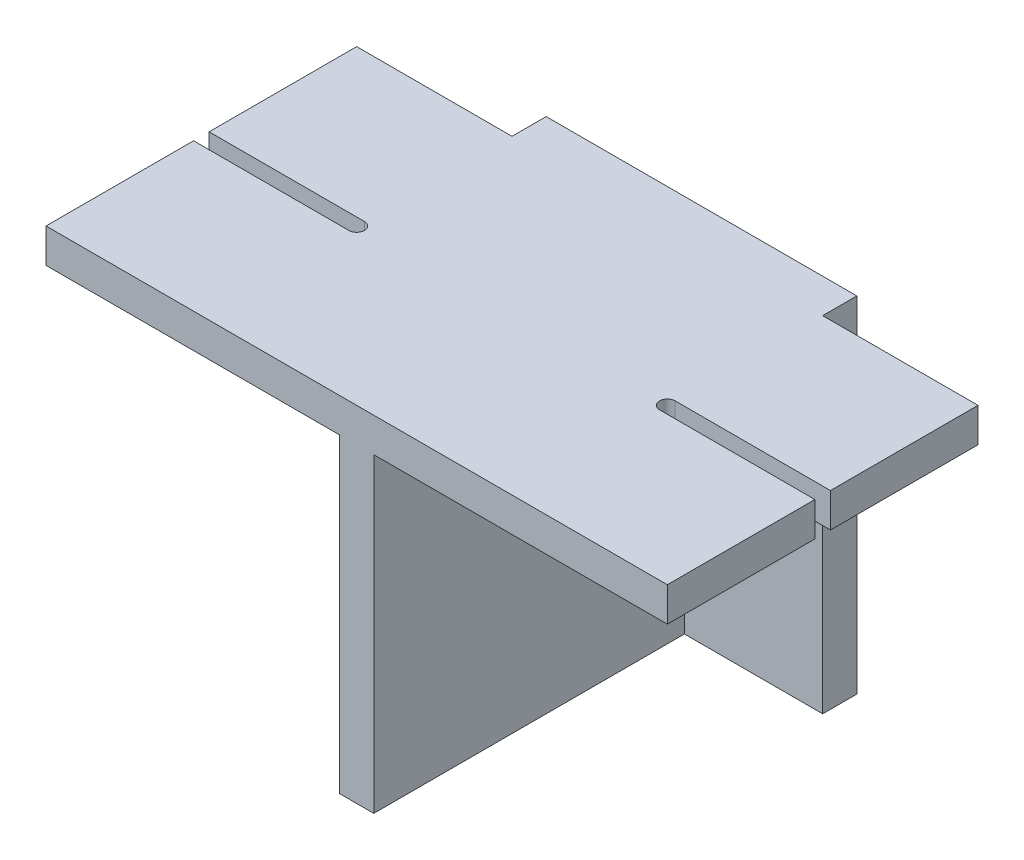
ISO-10303-21;
HEADER;
FILE_DESCRIPTION(('STEP AP214'),'2;1');
FILE_NAME('part.step','',(''),(''),'','','');
FILE_SCHEMA(('AUTOMOTIVE_DESIGN { 1 0 10303 214 1 1 1 1 }'));
ENDSEC;
DATA;
#1=APPLICATION_CONTEXT('core data for automotive mechanical design processes');
#2=APPLICATION_PROTOCOL_DEFINITION('international standard','automotive_design',2000,#1);
#3=PRODUCT_CONTEXT('',#1,'mechanical');
#4=PRODUCT('Part','Part','',(#3));
#5=PRODUCT_RELATED_PRODUCT_CATEGORY('part','',(#4));
#6=PRODUCT_DEFINITION_FORMATION('','',#4);
#7=PRODUCT_DEFINITION_CONTEXT('part definition',#1,'design');
#8=PRODUCT_DEFINITION('design','',#6,#7);
#9=PRODUCT_DEFINITION_SHAPE('','',#8);
#10=(LENGTH_UNIT() NAMED_UNIT(*) SI_UNIT(.MILLI.,.METRE.));
#11=(NAMED_UNIT(*) PLANE_ANGLE_UNIT() SI_UNIT($,.RADIAN.));
#12=(NAMED_UNIT(*) SI_UNIT($,.STERADIAN.) SOLID_ANGLE_UNIT());
#13=UNCERTAINTY_MEASURE_WITH_UNIT(LENGTH_MEASURE(1.E-05),#10,'distance_accuracy_value','');
#14=(GEOMETRIC_REPRESENTATION_CONTEXT(3) GLOBAL_UNCERTAINTY_ASSIGNED_CONTEXT((#13)) GLOBAL_UNIT_ASSIGNED_CONTEXT((#10,
#11,#12)) REPRESENTATION_CONTEXT('',''));
#15=CARTESIAN_POINT('',(0.,0.,0.));
#16=DIRECTION('',(0.,0.,1.));
#17=DIRECTION('',(1.,0.,0.));
#18=AXIS2_PLACEMENT_3D('',#15,#16,#17);
#19=CARTESIAN_POINT('',(-200.,22.,0.));
#20=DIRECTION('',(0.,0.,1.));
#21=DIRECTION('',(1.,0.,0.));
#22=AXIS2_PLACEMENT_3D('',#19,#20,#21);
#23=PLANE('',#22);
#24=DIRECTION('',(0.,1.,0.));
#25=VECTOR('',#24,1.);
#26=CARTESIAN_POINT('',(-100.,-401.20636172845,0.));
#27=LINE('',#26,#25);
#28=CARTESIAN_POINT('',(-100.,-2.22044604925031E-13,0.));
#29=VERTEX_POINT('',#28);
#30=CARTESIAN_POINT('',(-100.,22.,0.));
#31=VERTEX_POINT('',#30);
#32=EDGE_CURVE('E11',#29,#31,#27,.T.);
#33=ORIENTED_EDGE('',*,*,#32,.F.);
#34=DIRECTION('',(-1.,0.,0.));
#35=VECTOR('',#34,1.);
#36=CARTESIAN_POINT('',(-200.,0.,0.));
#37=LINE('',#36,#35);
#38=CARTESIAN_POINT('',(-200.,0.,0.));
#39=VERTEX_POINT('',#38);
#40=EDGE_CURVE('E285',#29,#39,#37,.T.);
#41=ORIENTED_EDGE('',*,*,#40,.T.);
#42=DIRECTION('',(0.,-1.,0.));
#43=VECTOR('',#42,1.);
#44=CARTESIAN_POINT('',(-200.,22.,0.));
#45=LINE('',#44,#43);
#46=CARTESIAN_POINT('',(-200.,22.,0.));
#47=VERTEX_POINT('',#46);
#48=EDGE_CURVE('E39',#47,#39,#45,.T.);
#49=ORIENTED_EDGE('',*,*,#48,.F.);
#50=DIRECTION('',(-1.,0.,0.));
#51=VECTOR('',#50,1.);
#52=CARTESIAN_POINT('',(-200.,22.,0.));
#53=LINE('',#52,#51);
#54=EDGE_CURVE('E290',#31,#47,#53,.T.);
#55=ORIENTED_EDGE('',*,*,#54,.F.);
#56=EDGE_LOOP('',(#33,#41,#49,#55));
#57=FACE_BOUND('',#56,.T.);
#58=ADVANCED_FACE('F35',(#57),#23,.F.);
#59=CARTESIAN_POINT('',(-100.,0.,100.));
#60=DIRECTION('',(0.,1.,0.));
#61=DIRECTION('',(0.,0.,1.));
#62=AXIS2_PLACEMENT_3D('',#59,#60,#61);
#63=PLANE('',#62);
#64=DIRECTION('',(0.,0.,1.));
#65=VECTOR('',#64,1.);
#66=CARTESIAN_POINT('',(11.,0.,0.));
#67=LINE('',#66,#65);
#68=CARTESIAN_POINT('',(10.9999999999999,0.,0.));
#69=VERTEX_POINT('',#68);
#70=CARTESIAN_POINT('',(11.,0.,200.));
#71=VERTEX_POINT('',#70);
#72=EDGE_CURVE('E221',#69,#71,#67,.T.);
#73=ORIENTED_EDGE('',*,*,#72,.F.);
#74=CARTESIAN_POINT('',(100.,-2.22044604925031E-13,0.));
#75=VERTEX_POINT('',#74);
#76=EDGE_CURVE('E307',#75,#69,#37,.T.);
#77=ORIENTED_EDGE('',*,*,#76,.F.);
#78=CARTESIAN_POINT('',(200.,0.,0.));
#79=VERTEX_POINT('',#78);
#80=EDGE_CURVE('E303',#79,#75,#37,.T.);
#81=ORIENTED_EDGE('',*,*,#80,.F.);
#82=DIRECTION('',(0.,0.,1.));
#83=VECTOR('',#82,1.);
#84=CARTESIAN_POINT('',(200.,0.,95.));
#85=LINE('',#84,#83);
#86=CARTESIAN_POINT('',(200.,0.,95.));
#87=VERTEX_POINT('',#86);
#88=EDGE_CURVE('E247',#79,#87,#85,.T.);
#89=ORIENTED_EDGE('',*,*,#88,.T.);
#90=DIRECTION('',(-1.,0.,0.));
#91=VECTOR('',#90,1.);
#92=CARTESIAN_POINT('',(100.,0.,95.));
#93=LINE('',#92,#91);
#94=CARTESIAN_POINT('',(100.,0.,95.));
#95=VERTEX_POINT('',#94);
#96=EDGE_CURVE('E267',#87,#95,#93,.T.);
#97=ORIENTED_EDGE('',*,*,#96,.T.);
#98=CARTESIAN_POINT('',(100.,0.,100.));
#99=DIRECTION('',(0.,1.,0.));
#100=DIRECTION('',(0.,0.,1.));
#101=AXIS2_PLACEMENT_3D('',#98,#99,#100);
#102=CIRCLE('',#101,5.00000000000002);
#103=CARTESIAN_POINT('',(100.,0.,105.));
#104=VERTEX_POINT('',#103);
#105=EDGE_CURVE('E264',#95,#104,#102,.T.);
#106=ORIENTED_EDGE('',*,*,#105,.T.);
#107=DIRECTION('',(1.,0.,0.));
#108=VECTOR('',#107,1.);
#109=CARTESIAN_POINT('',(200.,0.,105.));
#110=LINE('',#109,#108);
#111=CARTESIAN_POINT('',(200.,0.,105.));
#112=VERTEX_POINT('',#111);
#113=EDGE_CURVE('E261',#104,#112,#110,.T.);
#114=ORIENTED_EDGE('',*,*,#113,.T.);
#115=DIRECTION('',(0.,0.,1.));
#116=VECTOR('',#115,1.);
#117=CARTESIAN_POINT('',(200.,0.,200.));
#118=LINE('',#117,#116);
#119=CARTESIAN_POINT('',(200.,0.,200.));
#120=VERTEX_POINT('',#119);
#121=EDGE_CURVE('E242',#112,#120,#118,.T.);
#122=ORIENTED_EDGE('',*,*,#121,.T.);
#123=DIRECTION('',(1.,0.,0.));
#124=VECTOR('',#123,1.);
#125=CARTESIAN_POINT('',(0.,0.,200.));
#126=LINE('',#125,#124);
#127=EDGE_CURVE('E61',#71,#120,#126,.T.);
#128=ORIENTED_EDGE('',*,*,#127,.F.);
#129=EDGE_LOOP('',(#73,#77,#81,#89,#97,#106,#114,#122,#128));
#130=FACE_BOUND('',#129,.T.);
#131=ADVANCED_FACE('F353',(#130),#63,.F.);
#132=DIRECTION('',(0.,0.,-1.));
#133=VECTOR('',#132,1.);
#134=CARTESIAN_POINT('',(-11.0000000000001,0.,200.));
#135=LINE('',#134,#133);
#136=CARTESIAN_POINT('',(-11.,0.,200.));
#137=VERTEX_POINT('',#136);
#138=CARTESIAN_POINT('',(-11.,0.,0.));
#139=VERTEX_POINT('',#138);
#140=EDGE_CURVE('E225',#137,#139,#135,.T.);
#141=ORIENTED_EDGE('',*,*,#140,.F.);
#142=CARTESIAN_POINT('',(-200.,0.,200.));
#143=VERTEX_POINT('',#142);
#144=EDGE_CURVE('E317',#143,#137,#126,.T.);
#145=ORIENTED_EDGE('',*,*,#144,.F.);
#146=DIRECTION('',(0.,0.,1.));
#147=VECTOR('',#146,1.);
#148=CARTESIAN_POINT('',(-200.,0.,200.));
#149=LINE('',#148,#147);
#150=CARTESIAN_POINT('',(-200.,0.,105.));
#151=VERTEX_POINT('',#150);
#152=EDGE_CURVE('E315',#151,#143,#149,.T.);
#153=ORIENTED_EDGE('',*,*,#152,.F.);
#154=DIRECTION('',(-1.,0.,0.));
#155=VECTOR('',#154,1.);
#156=CARTESIAN_POINT('',(-200.,0.,105.));
#157=LINE('',#156,#155);
#158=CARTESIAN_POINT('',(-100.,0.,105.));
#159=VERTEX_POINT('',#158);
#160=EDGE_CURVE('E313',#159,#151,#157,.T.);
#161=ORIENTED_EDGE('',*,*,#160,.F.);
#162=CARTESIAN_POINT('',(-100.,0.,100.));
#163=DIRECTION('',(0.,-1.,0.));
#164=DIRECTION('',(0.,0.,1.));
#165=AXIS2_PLACEMENT_3D('',#162,#163,#164);
#166=CIRCLE('',#165,5.00000000000002);
#167=CARTESIAN_POINT('',(-100.,0.,95.));
#168=VERTEX_POINT('',#167);
#169=EDGE_CURVE('E311',#168,#159,#166,.T.);
#170=ORIENTED_EDGE('',*,*,#169,.F.);
#171=DIRECTION('',(1.,0.,0.));
#172=VECTOR('',#171,1.);
#173=CARTESIAN_POINT('',(-100.,0.,95.));
#174=LINE('',#173,#172);
#175=CARTESIAN_POINT('',(-200.,0.,95.));
#176=VERTEX_POINT('',#175);
#177=EDGE_CURVE('E309',#176,#168,#174,.T.);
#178=ORIENTED_EDGE('',*,*,#177,.F.);
#179=DIRECTION('',(0.,0.,1.));
#180=VECTOR('',#179,1.);
#181=CARTESIAN_POINT('',(-200.,0.,95.));
#182=LINE('',#181,#180);
#183=EDGE_CURVE('E306',#39,#176,#182,.T.);
#184=ORIENTED_EDGE('',*,*,#183,.F.);
#185=ORIENTED_EDGE('',*,*,#40,.F.);
#186=EDGE_CURVE('E197',#139,#29,#37,.T.);
#187=ORIENTED_EDGE('',*,*,#186,.F.);
#188=EDGE_LOOP('',(#141,#145,#153,#161,#170,#178,#184,#185,#187));
#189=FACE_BOUND('',#188,.T.);
#190=ADVANCED_FACE('F361',(#189),#63,.F.);
#191=ORIENTED_EDGE('',*,*,#80,.T.);
#192=DIRECTION('',(0.,1.,0.));
#193=VECTOR('',#192,1.);
#194=CARTESIAN_POINT('',(100.,-401.20636172845,0.));
#195=LINE('',#194,#193);
#196=CARTESIAN_POINT('',(99.9999999999999,22.,0.));
#197=VERTEX_POINT('',#196);
#198=EDGE_CURVE('E44',#75,#197,#195,.T.);
#199=ORIENTED_EDGE('',*,*,#198,.T.);
#200=CARTESIAN_POINT('',(200.,22.,0.));
#201=VERTEX_POINT('',#200);
#202=EDGE_CURVE('E286',#201,#197,#53,.T.);
#203=ORIENTED_EDGE('',*,*,#202,.F.);
#204=DIRECTION('',(0.,-1.,0.));
#205=VECTOR('',#204,1.);
#206=CARTESIAN_POINT('',(200.,22.,0.));
#207=LINE('',#206,#205);
#208=EDGE_CURVE('E259',#201,#79,#207,.T.);
#209=ORIENTED_EDGE('',*,*,#208,.T.);
#210=EDGE_LOOP('',(#191,#199,#203,#209));
#211=FACE_BOUND('',#210,.T.);
#212=ADVANCED_FACE('F37',(#211),#23,.F.);
#213=CARTESIAN_POINT('',(-200.,22.,95.));
#214=DIRECTION('',(1.,0.,0.));
#215=DIRECTION('',(0.,0.,-1.));
#216=AXIS2_PLACEMENT_3D('',#213,#214,#215);
#217=PLANE('',#216);
#218=ORIENTED_EDGE('',*,*,#183,.T.);
#219=DIRECTION('',(0.,-1.,0.));
#220=VECTOR('',#219,1.);
#221=CARTESIAN_POINT('',(-200.,22.,95.));
#222=LINE('',#221,#220);
#223=CARTESIAN_POINT('',(-200.,22.,95.));
#224=VERTEX_POINT('',#223);
#225=EDGE_CURVE('E330',#224,#176,#222,.T.);
#226=ORIENTED_EDGE('',*,*,#225,.F.);
#227=DIRECTION('',(0.,0.,1.));
#228=VECTOR('',#227,1.);
#229=CARTESIAN_POINT('',(-200.,22.,95.));
#230=LINE('',#229,#228);
#231=EDGE_CURVE('E289',#47,#224,#230,.T.);
#232=ORIENTED_EDGE('',*,*,#231,.F.);
#233=ORIENTED_EDGE('',*,*,#48,.T.);
#234=EDGE_LOOP('',(#218,#226,#232,#233));
#235=FACE_BOUND('',#234,.T.);
#236=ADVANCED_FACE('F363',(#235),#217,.F.);
#237=CARTESIAN_POINT('',(-100.,22.,95.));
#238=DIRECTION('',(0.,0.,-1.));
#239=DIRECTION('',(-1.,0.,0.));
#240=AXIS2_PLACEMENT_3D('',#237,#238,#239);
#241=PLANE('',#240);
#242=ORIENTED_EDGE('',*,*,#177,.T.);
#243=DIRECTION('',(0.,-1.,0.));
#244=VECTOR('',#243,1.);
#245=CARTESIAN_POINT('',(-100.,22.,95.));
#246=LINE('',#245,#244);
#247=CARTESIAN_POINT('',(-100.,22.,95.));
#248=VERTEX_POINT('',#247);
#249=EDGE_CURVE('E328',#248,#168,#246,.T.);
#250=ORIENTED_EDGE('',*,*,#249,.F.);
#251=DIRECTION('',(1.,0.,0.));
#252=VECTOR('',#251,1.);
#253=CARTESIAN_POINT('',(-100.,22.,95.));
#254=LINE('',#253,#252);
#255=EDGE_CURVE('E292',#224,#248,#254,.T.);
#256=ORIENTED_EDGE('',*,*,#255,.F.);
#257=ORIENTED_EDGE('',*,*,#225,.T.);
#258=EDGE_LOOP('',(#242,#250,#256,#257));
#259=FACE_BOUND('',#258,.T.);
#260=ADVANCED_FACE('F365',(#259),#241,.F.);
#261=CARTESIAN_POINT('',(-100.,22.,100.));
#262=DIRECTION('',(0.,-1.,0.));
#263=DIRECTION('',(0.,0.,-1.));
#264=AXIS2_PLACEMENT_3D('',#261,#262,#263);
#265=CYLINDRICAL_SURFACE('',#264,5.00000000000002);
#266=ORIENTED_EDGE('',*,*,#169,.T.);
#267=DIRECTION('',(0.,-1.,0.));
#268=VECTOR('',#267,1.);
#269=CARTESIAN_POINT('',(-100.,22.,105.));
#270=LINE('',#269,#268);
#271=CARTESIAN_POINT('',(-100.,22.,105.));
#272=VERTEX_POINT('',#271);
#273=EDGE_CURVE('E325',#272,#159,#270,.T.);
#274=ORIENTED_EDGE('',*,*,#273,.F.);
#275=CARTESIAN_POINT('',(-100.,22.,100.));
#276=DIRECTION('',(0.,-1.,0.));
#277=DIRECTION('',(0.,0.,1.));
#278=AXIS2_PLACEMENT_3D('',#275,#276,#277);
#279=CIRCLE('',#278,5.00000000000002);
#280=EDGE_CURVE('E294',#248,#272,#279,.T.);
#281=ORIENTED_EDGE('',*,*,#280,.F.);
#282=ORIENTED_EDGE('',*,*,#249,.T.);
#283=EDGE_LOOP('',(#266,#274,#281,#282));
#284=FACE_BOUND('',#283,.T.);
#285=ADVANCED_FACE('F402',(#284),#265,.F.);
#286=CARTESIAN_POINT('',(-200.,22.,105.));
#287=DIRECTION('',(0.,0.,1.));
#288=DIRECTION('',(1.,0.,0.));
#289=AXIS2_PLACEMENT_3D('',#286,#287,#288);
#290=PLANE('',#289);
#291=ORIENTED_EDGE('',*,*,#160,.T.);
#292=DIRECTION('',(0.,-1.,0.));
#293=VECTOR('',#292,1.);
#294=CARTESIAN_POINT('',(-200.,22.,105.));
#295=LINE('',#294,#293);
#296=CARTESIAN_POINT('',(-200.,22.,105.));
#297=VERTEX_POINT('',#296);
#298=EDGE_CURVE('E322',#297,#151,#295,.T.);
#299=ORIENTED_EDGE('',*,*,#298,.F.);
#300=DIRECTION('',(-1.,0.,0.));
#301=VECTOR('',#300,1.);
#302=CARTESIAN_POINT('',(-200.,22.,105.));
#303=LINE('',#302,#301);
#304=EDGE_CURVE('E296',#272,#297,#303,.T.);
#305=ORIENTED_EDGE('',*,*,#304,.F.);
#306=ORIENTED_EDGE('',*,*,#273,.T.);
#307=EDGE_LOOP('',(#291,#299,#305,#306));
#308=FACE_BOUND('',#307,.T.);
#309=ADVANCED_FACE('F400',(#308),#290,.F.);
#310=CARTESIAN_POINT('',(-200.,22.,200.));
#311=DIRECTION('',(1.,0.,0.));
#312=DIRECTION('',(0.,0.,-1.));
#313=AXIS2_PLACEMENT_3D('',#310,#311,#312);
#314=PLANE('',#313);
#315=ORIENTED_EDGE('',*,*,#152,.T.);
#316=DIRECTION('',(0.,-1.,0.));
#317=VECTOR('',#316,1.);
#318=CARTESIAN_POINT('',(-200.,22.,200.));
#319=LINE('',#318,#317);
#320=CARTESIAN_POINT('',(-200.,22.,200.));
#321=VERTEX_POINT('',#320);
#322=EDGE_CURVE('E302',#321,#143,#319,.T.);
#323=ORIENTED_EDGE('',*,*,#322,.F.);
#324=DIRECTION('',(0.,0.,1.));
#325=VECTOR('',#324,1.);
#326=CARTESIAN_POINT('',(-200.,22.,200.));
#327=LINE('',#326,#325);
#328=EDGE_CURVE('E298',#297,#321,#327,.T.);
#329=ORIENTED_EDGE('',*,*,#328,.F.);
#330=ORIENTED_EDGE('',*,*,#298,.T.);
#331=EDGE_LOOP('',(#315,#323,#329,#330));
#332=FACE_BOUND('',#331,.T.);
#333=ADVANCED_FACE('F391',(#332),#314,.F.);
#334=CARTESIAN_POINT('',(0.,22.,200.));
#335=DIRECTION('',(0.,0.,-1.));
#336=DIRECTION('',(-1.,0.,0.));
#337=AXIS2_PLACEMENT_3D('',#334,#335,#336);
#338=PLANE('',#337);
#339=ORIENTED_EDGE('',*,*,#144,.T.);
#340=DIRECTION('',(0.,1.,0.));
#341=VECTOR('',#340,1.);
#342=CARTESIAN_POINT('',(-11.0000000000001,-200.,200.));
#343=LINE('',#342,#341);
#344=CARTESIAN_POINT('',(-11.0000000000001,-200.,200.));
#345=VERTEX_POINT('',#344);
#346=EDGE_CURVE('E237',#345,#137,#343,.T.);
#347=ORIENTED_EDGE('',*,*,#346,.F.);
#348=DIRECTION('',(-1.,0.,0.));
#349=VECTOR('',#348,1.);
#350=CARTESIAN_POINT('',(10.9999999999999,-200.,200.));
#351=LINE('',#350,#349);
#352=CARTESIAN_POINT('',(10.9999999999999,-200.,200.));
#353=VERTEX_POINT('',#352);
#354=EDGE_CURVE('E224',#353,#345,#351,.T.);
#355=ORIENTED_EDGE('',*,*,#354,.F.);
#356=DIRECTION('',(0.,1.,0.));
#357=VECTOR('',#356,1.);
#358=CARTESIAN_POINT('',(10.9999999999999,-200.,200.));
#359=LINE('',#358,#357);
#360=EDGE_CURVE('E240',#353,#71,#359,.T.);
#361=ORIENTED_EDGE('',*,*,#360,.T.);
#362=ORIENTED_EDGE('',*,*,#127,.T.);
#363=DIRECTION('',(0.,-1.,0.));
#364=VECTOR('',#363,1.);
#365=CARTESIAN_POINT('',(200.,22.,200.));
#366=LINE('',#365,#364);
#367=CARTESIAN_POINT('',(200.,22.,200.));
#368=VERTEX_POINT('',#367);
#369=EDGE_CURVE('E282',#368,#120,#366,.T.);
#370=ORIENTED_EDGE('',*,*,#369,.F.);
#371=DIRECTION('',(1.,0.,0.));
#372=VECTOR('',#371,1.);
#373=CARTESIAN_POINT('',(0.,22.,200.));
#374=LINE('',#373,#372);
#375=EDGE_CURVE('E300',#321,#368,#374,.T.);
#376=ORIENTED_EDGE('',*,*,#375,.F.);
#377=ORIENTED_EDGE('',*,*,#322,.T.);
#378=EDGE_LOOP('',(#339,#347,#355,#361,#362,#370,#376,#377));
#379=FACE_BOUND('',#378,.T.);
#380=ADVANCED_FACE('F383',(#379),#338,.F.);
#381=CARTESIAN_POINT('',(-100.,22.,100.));
#382=DIRECTION('',(0.,1.,0.));
#383=DIRECTION('',(0.,0.,1.));
#384=AXIS2_PLACEMENT_3D('',#381,#382,#383);
#385=PLANE('',#384);
#386=ORIENTED_EDGE('',*,*,#202,.T.);
#387=DIRECTION('',(0.,0.,-1.));
#388=VECTOR('',#387,1.);
#389=CARTESIAN_POINT('',(100.,22.,-22.));
#390=LINE('',#389,#388);
#391=CARTESIAN_POINT('',(100.,22.,-22.));
#392=VERTEX_POINT('',#391);
#393=EDGE_CURVE('E53',#197,#392,#390,.T.);
#394=ORIENTED_EDGE('',*,*,#393,.T.);
#395=DIRECTION('',(-1.,0.,0.));
#396=VECTOR('',#395,1.);
#397=CARTESIAN_POINT('',(-100.,22.,-22.));
#398=LINE('',#397,#396);
#399=CARTESIAN_POINT('',(-100.,22.,-22.));
#400=VERTEX_POINT('',#399);
#401=EDGE_CURVE('E209',#392,#400,#398,.T.);
#402=ORIENTED_EDGE('',*,*,#401,.T.);
#403=DIRECTION('',(0.,0.,1.));
#404=VECTOR('',#403,1.);
#405=CARTESIAN_POINT('',(-100.,22.,0.));
#406=LINE('',#405,#404);
#407=EDGE_CURVE('E205',#400,#31,#406,.T.);
#408=ORIENTED_EDGE('',*,*,#407,.T.);
#409=ORIENTED_EDGE('',*,*,#54,.T.);
#410=ORIENTED_EDGE('',*,*,#231,.T.);
#411=ORIENTED_EDGE('',*,*,#255,.T.);
#412=ORIENTED_EDGE('',*,*,#280,.T.);
#413=ORIENTED_EDGE('',*,*,#304,.T.);
#414=ORIENTED_EDGE('',*,*,#328,.T.);
#415=ORIENTED_EDGE('',*,*,#375,.T.);
#416=DIRECTION('',(0.,0.,1.));
#417=VECTOR('',#416,1.);
#418=CARTESIAN_POINT('',(200.,22.,200.));
#419=LINE('',#418,#417);
#420=CARTESIAN_POINT('',(200.,22.,105.));
#421=VERTEX_POINT('',#420);
#422=EDGE_CURVE('E243',#421,#368,#419,.T.);
#423=ORIENTED_EDGE('',*,*,#422,.F.);
#424=DIRECTION('',(1.,0.,0.));
#425=VECTOR('',#424,1.);
#426=CARTESIAN_POINT('',(200.,22.,105.));
#427=LINE('',#426,#425);
#428=CARTESIAN_POINT('',(100.,22.,105.));
#429=VERTEX_POINT('',#428);
#430=EDGE_CURVE('E246',#429,#421,#427,.T.);
#431=ORIENTED_EDGE('',*,*,#430,.F.);
#432=CARTESIAN_POINT('',(100.,22.,100.));
#433=DIRECTION('',(0.,1.,0.));
#434=DIRECTION('',(0.,0.,1.));
#435=AXIS2_PLACEMENT_3D('',#432,#433,#434);
#436=CIRCLE('',#435,5.00000000000002);
#437=CARTESIAN_POINT('',(100.,22.,95.));
#438=VERTEX_POINT('',#437);
#439=EDGE_CURVE('E250',#438,#429,#436,.T.);
#440=ORIENTED_EDGE('',*,*,#439,.F.);
#441=DIRECTION('',(-1.,0.,0.));
#442=VECTOR('',#441,1.);
#443=CARTESIAN_POINT('',(100.,22.,95.));
#444=LINE('',#443,#442);
#445=CARTESIAN_POINT('',(200.,22.,95.));
#446=VERTEX_POINT('',#445);
#447=EDGE_CURVE('E253',#446,#438,#444,.T.);
#448=ORIENTED_EDGE('',*,*,#447,.F.);
#449=DIRECTION('',(0.,0.,1.));
#450=VECTOR('',#449,1.);
#451=CARTESIAN_POINT('',(200.,22.,95.));
#452=LINE('',#451,#450);
#453=EDGE_CURVE('E256',#201,#446,#452,.T.);
#454=ORIENTED_EDGE('',*,*,#453,.F.);
#455=EDGE_LOOP('',(#386,#394,#402,#408,#409,#410,#411,#412,#413,#414,#415,#423,#431,#440,#448,#454));
#456=FACE_BOUND('',#455,.T.);
#457=ADVANCED_FACE('F345',(#456),#385,.T.);
#458=CARTESIAN_POINT('',(200.,22.,200.));
#459=DIRECTION('',(1.,0.,0.));
#460=DIRECTION('',(0.,0.,-1.));
#461=AXIS2_PLACEMENT_3D('',#458,#459,#460);
#462=PLANE('',#461);
#463=ORIENTED_EDGE('',*,*,#121,.F.);
#464=DIRECTION('',(0.,-1.,0.));
#465=VECTOR('',#464,1.);
#466=CARTESIAN_POINT('',(200.,22.,105.));
#467=LINE('',#466,#465);
#468=EDGE_CURVE('E280',#421,#112,#467,.T.);
#469=ORIENTED_EDGE('',*,*,#468,.F.);
#470=ORIENTED_EDGE('',*,*,#422,.T.);
#471=ORIENTED_EDGE('',*,*,#369,.T.);
#472=EDGE_LOOP('',(#463,#469,#470,#471));
#473=FACE_BOUND('',#472,.T.);
#474=ADVANCED_FACE('F445',(#473),#462,.T.);
#475=CARTESIAN_POINT('',(200.,22.,105.));
#476=DIRECTION('',(0.,0.,-1.));
#477=DIRECTION('',(-1.,0.,0.));
#478=AXIS2_PLACEMENT_3D('',#475,#476,#477);
#479=PLANE('',#478);
#480=ORIENTED_EDGE('',*,*,#113,.F.);
#481=DIRECTION('',(0.,-1.,0.));
#482=VECTOR('',#481,1.);
#483=CARTESIAN_POINT('',(100.,22.,105.));
#484=LINE('',#483,#482);
#485=EDGE_CURVE('E278',#429,#104,#484,.T.);
#486=ORIENTED_EDGE('',*,*,#485,.F.);
#487=ORIENTED_EDGE('',*,*,#430,.T.);
#488=ORIENTED_EDGE('',*,*,#468,.T.);
#489=EDGE_LOOP('',(#480,#486,#487,#488));
#490=FACE_BOUND('',#489,.T.);
#491=ADVANCED_FACE('F451',(#490),#479,.T.);
#492=CARTESIAN_POINT('',(100.,22.,100.));
#493=DIRECTION('',(0.,-1.,0.));
#494=DIRECTION('',(0.,0.,-1.));
#495=AXIS2_PLACEMENT_3D('',#492,#493,#494);
#496=CYLINDRICAL_SURFACE('',#495,5.00000000000002);
#497=ORIENTED_EDGE('',*,*,#105,.F.);
#498=DIRECTION('',(0.,-1.,0.));
#499=VECTOR('',#498,1.);
#500=CARTESIAN_POINT('',(100.,22.,95.));
#501=LINE('',#500,#499);
#502=EDGE_CURVE('E276',#438,#95,#501,.T.);
#503=ORIENTED_EDGE('',*,*,#502,.F.);
#504=ORIENTED_EDGE('',*,*,#439,.T.);
#505=ORIENTED_EDGE('',*,*,#485,.T.);
#506=EDGE_LOOP('',(#497,#503,#504,#505));
#507=FACE_BOUND('',#506,.T.);
#508=ADVANCED_FACE('F458',(#507),#496,.F.);
#509=CARTESIAN_POINT('',(100.,22.,95.));
#510=DIRECTION('',(0.,0.,1.));
#511=DIRECTION('',(1.,0.,0.));
#512=AXIS2_PLACEMENT_3D('',#509,#510,#511);
#513=PLANE('',#512);
#514=ORIENTED_EDGE('',*,*,#96,.F.);
#515=DIRECTION('',(0.,-1.,0.));
#516=VECTOR('',#515,1.);
#517=CARTESIAN_POINT('',(200.,22.,95.));
#518=LINE('',#517,#516);
#519=EDGE_CURVE('E274',#446,#87,#518,.T.);
#520=ORIENTED_EDGE('',*,*,#519,.F.);
#521=ORIENTED_EDGE('',*,*,#447,.T.);
#522=ORIENTED_EDGE('',*,*,#502,.T.);
#523=EDGE_LOOP('',(#514,#520,#521,#522));
#524=FACE_BOUND('',#523,.T.);
#525=ADVANCED_FACE('F466',(#524),#513,.T.);
#526=CARTESIAN_POINT('',(200.,22.,95.));
#527=DIRECTION('',(1.,0.,0.));
#528=DIRECTION('',(0.,0.,-1.));
#529=AXIS2_PLACEMENT_3D('',#526,#527,#528);
#530=PLANE('',#529);
#531=ORIENTED_EDGE('',*,*,#88,.F.);
#532=ORIENTED_EDGE('',*,*,#208,.F.);
#533=ORIENTED_EDGE('',*,*,#453,.T.);
#534=ORIENTED_EDGE('',*,*,#519,.T.);
#535=EDGE_LOOP('',(#531,#532,#533,#534));
#536=FACE_BOUND('',#535,.T.);
#537=ADVANCED_FACE('F351',(#536),#530,.T.);
#538=CARTESIAN_POINT('',(11.,-200.,0.));
#539=DIRECTION('',(-1.,0.,0.));
#540=DIRECTION('',(0.,0.,1.));
#541=AXIS2_PLACEMENT_3D('',#538,#539,#540);
#542=PLANE('',#541);
#543=ORIENTED_EDGE('',*,*,#72,.T.);
#544=ORIENTED_EDGE('',*,*,#360,.F.);
#545=DIRECTION('',(0.,0.,1.));
#546=VECTOR('',#545,1.);
#547=CARTESIAN_POINT('',(11.,-200.,0.));
#548=LINE('',#547,#546);
#549=CARTESIAN_POINT('',(11.,-200.,0.));
#550=VERTEX_POINT('',#549);
#551=EDGE_CURVE('E222',#550,#353,#548,.T.);
#552=ORIENTED_EDGE('',*,*,#551,.F.);
#553=DIRECTION('',(0.,1.,0.));
#554=VECTOR('',#553,1.);
#555=CARTESIAN_POINT('',(11.,-200.,0.));
#556=LINE('',#555,#554);
#557=EDGE_CURVE('E228',#550,#69,#556,.T.);
#558=ORIENTED_EDGE('',*,*,#557,.T.);
#559=EDGE_LOOP('',(#543,#544,#552,#558));
#560=FACE_BOUND('',#559,.T.);
#561=ADVANCED_FACE('F379',(#560),#542,.F.);
#562=CARTESIAN_POINT('',(-11.0000000000001,-200.,200.));
#563=DIRECTION('',(1.,0.,0.));
#564=DIRECTION('',(0.,0.,-1.));
#565=AXIS2_PLACEMENT_3D('',#562,#563,#564);
#566=PLANE('',#565);
#567=ORIENTED_EDGE('',*,*,#140,.T.);
#568=DIRECTION('',(0.,1.,0.));
#569=VECTOR('',#568,1.);
#570=CARTESIAN_POINT('',(-11.,-200.,0.));
#571=LINE('',#570,#569);
#572=CARTESIAN_POINT('',(-11.,-200.,0.));
#573=VERTEX_POINT('',#572);
#574=EDGE_CURVE('E235',#573,#139,#571,.T.);
#575=ORIENTED_EDGE('',*,*,#574,.F.);
#576=DIRECTION('',(0.,0.,-1.));
#577=VECTOR('',#576,1.);
#578=CARTESIAN_POINT('',(-11.0000000000001,-200.,200.));
#579=LINE('',#578,#577);
#580=EDGE_CURVE('E188',#345,#573,#579,.T.);
#581=ORIENTED_EDGE('',*,*,#580,.F.);
#582=ORIENTED_EDGE('',*,*,#346,.T.);
#583=EDGE_LOOP('',(#567,#575,#581,#582));
#584=FACE_BOUND('',#583,.T.);
#585=ADVANCED_FACE('F386',(#584),#566,.F.);
#586=CARTESIAN_POINT('',(0.,-200.,0.));
#587=DIRECTION('',(0.,-1.,0.));
#588=DIRECTION('',(0.,0.,-1.));
#589=AXIS2_PLACEMENT_3D('',#586,#587,#588);
#590=PLANE('',#589);
#591=ORIENTED_EDGE('',*,*,#551,.T.);
#592=ORIENTED_EDGE('',*,*,#354,.T.);
#593=ORIENTED_EDGE('',*,*,#580,.T.);
#594=DIRECTION('',(1.,0.,0.));
#595=VECTOR('',#594,1.);
#596=CARTESIAN_POINT('',(100.,-200.,0.));
#597=LINE('',#596,#595);
#598=CARTESIAN_POINT('',(-100.,-200.,0.));
#599=VERTEX_POINT('',#598);
#600=EDGE_CURVE('E180',#599,#573,#597,.T.);
#601=ORIENTED_EDGE('',*,*,#600,.F.);
#602=DIRECTION('',(0.,0.,1.));
#603=VECTOR('',#602,1.);
#604=CARTESIAN_POINT('',(-100.,-200.,0.));
#605=LINE('',#604,#603);
#606=CARTESIAN_POINT('',(-100.,-200.,-22.));
#607=VERTEX_POINT('',#606);
#608=EDGE_CURVE('E185',#607,#599,#605,.T.);
#609=ORIENTED_EDGE('',*,*,#608,.F.);
#610=DIRECTION('',(-1.,0.,0.));
#611=VECTOR('',#610,1.);
#612=CARTESIAN_POINT('',(-100.,-200.,-22.));
#613=LINE('',#612,#611);
#614=CARTESIAN_POINT('',(100.,-200.,-22.));
#615=VERTEX_POINT('',#614);
#616=EDGE_CURVE('E211',#615,#607,#613,.T.);
#617=ORIENTED_EDGE('',*,*,#616,.F.);
#618=DIRECTION('',(0.,0.,-1.));
#619=VECTOR('',#618,1.);
#620=CARTESIAN_POINT('',(100.,-200.,-22.));
#621=LINE('',#620,#619);
#622=CARTESIAN_POINT('',(100.,-200.,0.));
#623=VERTEX_POINT('',#622);
#624=EDGE_CURVE('E214',#623,#615,#621,.T.);
#625=ORIENTED_EDGE('',*,*,#624,.F.);
#626=EDGE_CURVE('E192',#550,#623,#597,.T.);
#627=ORIENTED_EDGE('',*,*,#626,.F.);
#628=EDGE_LOOP('',(#591,#592,#593,#601,#609,#617,#625,#627));
#629=FACE_BOUND('',#628,.T.);
#630=ADVANCED_FACE('F183',(#629),#590,.T.);
#631=CARTESIAN_POINT('',(100.,-401.20636172845,0.));
#632=DIRECTION('',(0.,0.,1.));
#633=DIRECTION('',(1.,0.,0.));
#634=AXIS2_PLACEMENT_3D('',#631,#632,#633);
#635=PLANE('',#634);
#636=EDGE_CURVE('E191',#623,#75,#195,.T.);
#637=ORIENTED_EDGE('',*,*,#636,.T.);
#638=ORIENTED_EDGE('',*,*,#76,.T.);
#639=ORIENTED_EDGE('',*,*,#557,.F.);
#640=ORIENTED_EDGE('',*,*,#626,.T.);
#641=EDGE_LOOP('',(#637,#638,#639,#640));
#642=FACE_BOUND('',#641,.T.);
#643=ADVANCED_FACE('F377',(#642),#635,.T.);
#644=CARTESIAN_POINT('',(-100.,-401.20636172845,0.));
#645=DIRECTION('',(-1.,0.,0.));
#646=DIRECTION('',(0.,0.,1.));
#647=AXIS2_PLACEMENT_3D('',#644,#645,#646);
#648=PLANE('',#647);
#649=DIRECTION('',(0.,1.,0.));
#650=VECTOR('',#649,1.);
#651=CARTESIAN_POINT('',(-100.,-401.20636172845,-22.));
#652=LINE('',#651,#650);
#653=EDGE_CURVE('E203',#607,#400,#652,.T.);
#654=ORIENTED_EDGE('',*,*,#653,.F.);
#655=ORIENTED_EDGE('',*,*,#608,.T.);
#656=EDGE_CURVE('E46',#599,#29,#27,.T.);
#657=ORIENTED_EDGE('',*,*,#656,.T.);
#658=ORIENTED_EDGE('',*,*,#32,.T.);
#659=ORIENTED_EDGE('',*,*,#407,.F.);
#660=EDGE_LOOP('',(#654,#655,#657,#658,#659));
#661=FACE_BOUND('',#660,.T.);
#662=ADVANCED_FACE('F201',(#661),#648,.T.);
#663=ORIENTED_EDGE('',*,*,#600,.T.);
#664=ORIENTED_EDGE('',*,*,#574,.T.);
#665=ORIENTED_EDGE('',*,*,#186,.T.);
#666=ORIENTED_EDGE('',*,*,#656,.F.);
#667=EDGE_LOOP('',(#663,#664,#665,#666));
#668=FACE_BOUND('',#667,.T.);
#669=ADVANCED_FACE('F195',(#668),#635,.T.);
#670=CARTESIAN_POINT('',(100.,-401.20636172845,-22.));
#671=DIRECTION('',(1.,0.,0.));
#672=DIRECTION('',(0.,0.,-1.));
#673=AXIS2_PLACEMENT_3D('',#670,#671,#672);
#674=PLANE('',#673);
#675=ORIENTED_EDGE('',*,*,#636,.F.);
#676=ORIENTED_EDGE('',*,*,#624,.T.);
#677=DIRECTION('',(0.,1.,0.));
#678=VECTOR('',#677,1.);
#679=CARTESIAN_POINT('',(100.,-401.20636172845,-22.));
#680=LINE('',#679,#678);
#681=EDGE_CURVE('E213',#615,#392,#680,.T.);
#682=ORIENTED_EDGE('',*,*,#681,.T.);
#683=ORIENTED_EDGE('',*,*,#393,.F.);
#684=ORIENTED_EDGE('',*,*,#198,.F.);
#685=EDGE_LOOP('',(#675,#676,#682,#683,#684));
#686=FACE_BOUND('',#685,.T.);
#687=ADVANCED_FACE('F376',(#686),#674,.T.);
#688=CARTESIAN_POINT('',(-100.,-401.20636172845,-22.));
#689=DIRECTION('',(0.,0.,-1.));
#690=DIRECTION('',(-1.,0.,0.));
#691=AXIS2_PLACEMENT_3D('',#688,#689,#690);
#692=PLANE('',#691);
#693=ORIENTED_EDGE('',*,*,#681,.F.);
#694=ORIENTED_EDGE('',*,*,#616,.T.);
#695=ORIENTED_EDGE('',*,*,#653,.T.);
#696=ORIENTED_EDGE('',*,*,#401,.F.);
#697=EDGE_LOOP('',(#693,#694,#695,#696));
#698=FACE_BOUND('',#697,.T.);
#699=ADVANCED_FACE('F372',(#698),#692,.T.);
#700=CLOSED_SHELL('',(#58,#131,#190,#212,#236,#260,#285,#309,#333,#380,#457,#474,#491,#508,#525,
#537,#561,#585,#630,#643,#662,#669,#687,#699));
#701=MANIFOLD_SOLID_BREP('B2',#700);
#702=ADVANCED_BREP_SHAPE_REPRESENTATION('',(#18,#701),#14);
#703=SHAPE_DEFINITION_REPRESENTATION(#9,#702);
ENDSEC;
END-ISO-10303-21;
